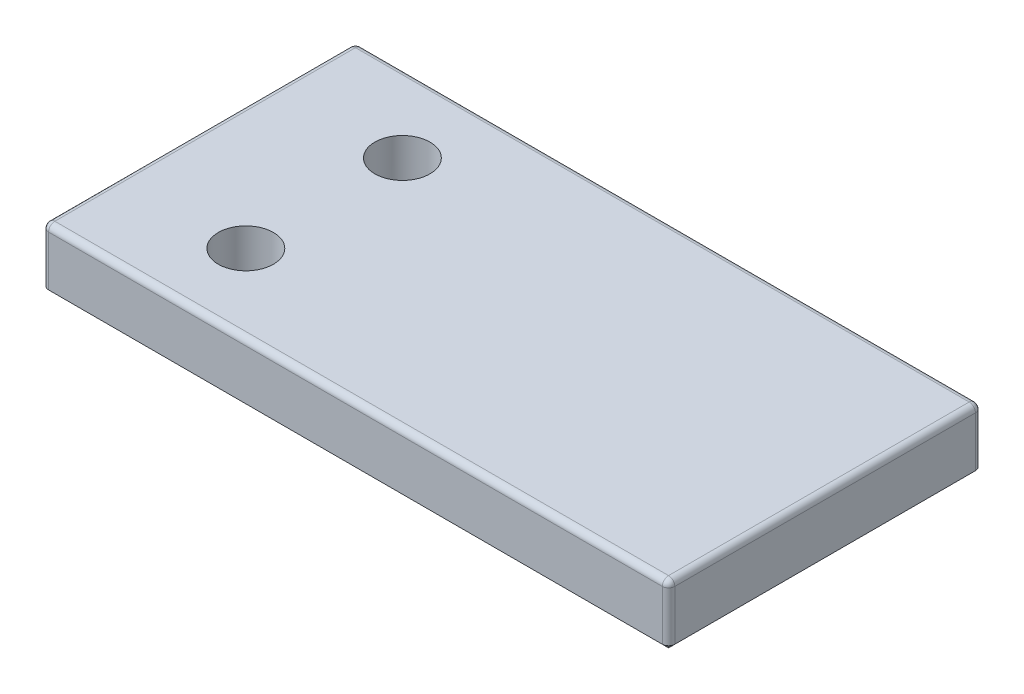
ISO-10303-21;
HEADER;
FILE_DESCRIPTION(('STEP AP214'),'2;1');
FILE_NAME('part.step','',(''),(''),'','','');
FILE_SCHEMA(('AUTOMOTIVE_DESIGN { 1 0 10303 214 1 1 1 1 }'));
ENDSEC;
DATA;
#1=APPLICATION_CONTEXT('core data for automotive mechanical design processes');
#2=APPLICATION_PROTOCOL_DEFINITION('international standard','automotive_design',2000,#1);
#3=PRODUCT_CONTEXT('',#1,'mechanical');
#4=PRODUCT('Part','Part','',(#3));
#5=PRODUCT_RELATED_PRODUCT_CATEGORY('part','',(#4));
#6=PRODUCT_DEFINITION_FORMATION('','',#4);
#7=PRODUCT_DEFINITION_CONTEXT('part definition',#1,'design');
#8=PRODUCT_DEFINITION('design','',#6,#7);
#9=PRODUCT_DEFINITION_SHAPE('','',#8);
#10=(LENGTH_UNIT() NAMED_UNIT(*) SI_UNIT(.MILLI.,.METRE.));
#11=(NAMED_UNIT(*) PLANE_ANGLE_UNIT() SI_UNIT($,.RADIAN.));
#12=(NAMED_UNIT(*) SI_UNIT($,.STERADIAN.) SOLID_ANGLE_UNIT());
#13=UNCERTAINTY_MEASURE_WITH_UNIT(LENGTH_MEASURE(1.E-05),#10,'distance_accuracy_value','');
#14=(GEOMETRIC_REPRESENTATION_CONTEXT(3) GLOBAL_UNCERTAINTY_ASSIGNED_CONTEXT((#13)) GLOBAL_UNIT_ASSIGNED_CONTEXT((#10,
#11,#12)) REPRESENTATION_CONTEXT('',''));
#15=CARTESIAN_POINT('',(0.,0.,0.));
#16=DIRECTION('',(0.,0.,1.));
#17=DIRECTION('',(1.,0.,0.));
#18=AXIS2_PLACEMENT_3D('',#15,#16,#17);
#19=CARTESIAN_POINT('',(0.,10.,0.));
#20=DIRECTION('',(1.,0.,0.));
#21=DIRECTION('',(0.,0.,-1.));
#22=AXIS2_PLACEMENT_3D('',#19,#20,#21);
#23=PLANE('',#22);
#24=DIRECTION('',(0.,-1.,0.));
#25=VECTOR('',#24,1.);
#26=CARTESIAN_POINT('',(0.,10.,-1.));
#27=LINE('',#26,#25);
#28=CARTESIAN_POINT('',(0.,1.,-1.));
#29=VERTEX_POINT('',#28);
#30=CARTESIAN_POINT('',(0.,9.,-1.));
#31=VERTEX_POINT('',#30);
#32=EDGE_CURVE('E263',#29,#31,#27,.F.);
#33=ORIENTED_EDGE('',*,*,#32,.T.);
#34=DIRECTION('',(0.,0.,1.));
#35=VECTOR('',#34,1.);
#36=CARTESIAN_POINT('',(0.,9.,0.));
#37=LINE('',#36,#35);
#38=CARTESIAN_POINT('',(0.,9.,-49.));
#39=VERTEX_POINT('',#38);
#40=EDGE_CURVE('E225',#31,#39,#37,.F.);
#41=ORIENTED_EDGE('',*,*,#40,.T.);
#42=DIRECTION('',(0.,-1.,0.));
#43=VECTOR('',#42,1.);
#44=CARTESIAN_POINT('',(0.,10.,-49.));
#45=LINE('',#44,#43);
#46=CARTESIAN_POINT('',(0.,1.,-49.));
#47=VERTEX_POINT('',#46);
#48=EDGE_CURVE('E266',#39,#47,#45,.T.);
#49=ORIENTED_EDGE('',*,*,#48,.T.);
#50=DIRECTION('',(0.,0.,1.));
#51=VECTOR('',#50,1.);
#52=CARTESIAN_POINT('',(0.,1.,-1.));
#53=LINE('',#52,#51);
#54=EDGE_CURVE('E153',#47,#29,#53,.T.);
#55=ORIENTED_EDGE('',*,*,#54,.T.);
#56=EDGE_LOOP('',(#33,#41,#49,#55));
#57=FACE_BOUND('',#56,.T.);
#58=ADVANCED_FACE('F39',(#57),#23,.F.);
#59=CARTESIAN_POINT('',(0.,10.,0.));
#60=DIRECTION('',(0.,0.,-1.));
#61=DIRECTION('',(-1.,0.,0.));
#62=AXIS2_PLACEMENT_3D('',#59,#60,#61);
#63=PLANE('',#62);
#64=DIRECTION('',(0.,-1.,0.));
#65=VECTOR('',#64,1.);
#66=CARTESIAN_POINT('',(99.,10.,0.));
#67=LINE('',#66,#65);
#68=CARTESIAN_POINT('',(99.,1.,0.));
#69=VERTEX_POINT('',#68);
#70=CARTESIAN_POINT('',(99.,9.,0.));
#71=VERTEX_POINT('',#70);
#72=EDGE_CURVE('E173',#69,#71,#67,.F.);
#73=ORIENTED_EDGE('',*,*,#72,.T.);
#74=DIRECTION('',(1.,0.,0.));
#75=VECTOR('',#74,1.);
#76=CARTESIAN_POINT('',(0.,9.,0.));
#77=LINE('',#76,#75);
#78=CARTESIAN_POINT('',(1.,9.,0.));
#79=VERTEX_POINT('',#78);
#80=EDGE_CURVE('E11',#71,#79,#77,.F.);
#81=ORIENTED_EDGE('',*,*,#80,.T.);
#82=DIRECTION('',(0.,-1.,0.));
#83=VECTOR('',#82,1.);
#84=CARTESIAN_POINT('',(1.,10.,0.));
#85=LINE('',#84,#83);
#86=CARTESIAN_POINT('',(1.,1.,0.));
#87=VERTEX_POINT('',#86);
#88=EDGE_CURVE('E169',#79,#87,#85,.T.);
#89=ORIENTED_EDGE('',*,*,#88,.T.);
#90=DIRECTION('',(1.,0.,0.));
#91=VECTOR('',#90,1.);
#92=CARTESIAN_POINT('',(99.,1.,0.));
#93=LINE('',#92,#91);
#94=EDGE_CURVE('E194',#87,#69,#93,.T.);
#95=ORIENTED_EDGE('',*,*,#94,.T.);
#96=EDGE_LOOP('',(#73,#81,#89,#95));
#97=FACE_BOUND('',#96,.T.);
#98=ADVANCED_FACE('F272',(#97),#63,.F.);
#99=CARTESIAN_POINT('',(100.,10.,0.));
#100=DIRECTION('',(-1.,0.,0.));
#101=DIRECTION('',(0.,0.,1.));
#102=AXIS2_PLACEMENT_3D('',#99,#100,#101);
#103=PLANE('',#102);
#104=DIRECTION('',(0.,-1.,0.));
#105=VECTOR('',#104,1.);
#106=CARTESIAN_POINT('',(100.,10.,-49.));
#107=LINE('',#106,#105);
#108=CARTESIAN_POINT('',(100.,1.,-49.));
#109=VERTEX_POINT('',#108);
#110=CARTESIAN_POINT('',(100.,9.,-49.));
#111=VERTEX_POINT('',#110);
#112=EDGE_CURVE('E149',#109,#111,#107,.F.);
#113=ORIENTED_EDGE('',*,*,#112,.T.);
#114=DIRECTION('',(0.,0.,-1.));
#115=VECTOR('',#114,1.);
#116=CARTESIAN_POINT('',(100.,9.,0.));
#117=LINE('',#116,#115);
#118=CARTESIAN_POINT('',(100.,9.,-1.));
#119=VERTEX_POINT('',#118);
#120=EDGE_CURVE('E63',#111,#119,#117,.F.);
#121=ORIENTED_EDGE('',*,*,#120,.T.);
#122=DIRECTION('',(0.,-1.,0.));
#123=VECTOR('',#122,1.);
#124=CARTESIAN_POINT('',(100.,10.,-1.));
#125=LINE('',#124,#123);
#126=CARTESIAN_POINT('',(100.,1.,-1.));
#127=VERTEX_POINT('',#126);
#128=EDGE_CURVE('E141',#119,#127,#125,.T.);
#129=ORIENTED_EDGE('',*,*,#128,.T.);
#130=DIRECTION('',(0.,0.,-1.));
#131=VECTOR('',#130,1.);
#132=CARTESIAN_POINT('',(100.,1.,-49.));
#133=LINE('',#132,#131);
#134=EDGE_CURVE('E186',#127,#109,#133,.T.);
#135=ORIENTED_EDGE('',*,*,#134,.T.);
#136=EDGE_LOOP('',(#113,#121,#129,#135));
#137=FACE_BOUND('',#136,.T.);
#138=ADVANCED_FACE('F261',(#137),#103,.F.);
#139=CARTESIAN_POINT('',(0.,10.,-50.));
#140=DIRECTION('',(0.,0.,1.));
#141=DIRECTION('',(1.,0.,0.));
#142=AXIS2_PLACEMENT_3D('',#139,#140,#141);
#143=PLANE('',#142);
#144=DIRECTION('',(0.,-1.,0.));
#145=VECTOR('',#144,1.);
#146=CARTESIAN_POINT('',(1.,10.,-50.));
#147=LINE('',#146,#145);
#148=CARTESIAN_POINT('',(1.,1.,-50.));
#149=VERTEX_POINT('',#148);
#150=CARTESIAN_POINT('',(1.,9.,-50.));
#151=VERTEX_POINT('',#150);
#152=EDGE_CURVE('E142',#149,#151,#147,.F.);
#153=ORIENTED_EDGE('',*,*,#152,.T.);
#154=DIRECTION('',(-1.,0.,0.));
#155=VECTOR('',#154,1.);
#156=CARTESIAN_POINT('',(0.,9.,-50.));
#157=LINE('',#156,#155);
#158=CARTESIAN_POINT('',(99.,9.,-50.));
#159=VERTEX_POINT('',#158);
#160=EDGE_CURVE('E138',#151,#159,#157,.F.);
#161=ORIENTED_EDGE('',*,*,#160,.T.);
#162=DIRECTION('',(0.,-1.,0.));
#163=VECTOR('',#162,1.);
#164=CARTESIAN_POINT('',(99.,10.,-50.));
#165=LINE('',#164,#163);
#166=CARTESIAN_POINT('',(99.,1.,-50.));
#167=VERTEX_POINT('',#166);
#168=EDGE_CURVE('E130',#159,#167,#165,.T.);
#169=ORIENTED_EDGE('',*,*,#168,.T.);
#170=DIRECTION('',(-1.,0.,0.));
#171=VECTOR('',#170,1.);
#172=CARTESIAN_POINT('',(1.,1.,-50.));
#173=LINE('',#172,#171);
#174=EDGE_CURVE('E135',#167,#149,#173,.T.);
#175=ORIENTED_EDGE('',*,*,#174,.T.);
#176=EDGE_LOOP('',(#153,#161,#169,#175));
#177=FACE_BOUND('',#176,.T.);
#178=ADVANCED_FACE('F133',(#177),#143,.F.);
#179=CARTESIAN_POINT('',(0.,10.,0.));
#180=DIRECTION('',(0.,-1.,0.));
#181=DIRECTION('',(0.,0.,-1.));
#182=AXIS2_PLACEMENT_3D('',#179,#180,#181);
#183=PLANE('',#182);
#184=DIRECTION('',(-1.,0.,0.));
#185=VECTOR('',#184,1.);
#186=CARTESIAN_POINT('',(0.,10.,-49.));
#187=LINE('',#186,#185);
#188=CARTESIAN_POINT('',(99.,10.,-49.));
#189=VERTEX_POINT('',#188);
#190=CARTESIAN_POINT('',(1.,10.,-49.));
#191=VERTEX_POINT('',#190);
#192=EDGE_CURVE('E220',#189,#191,#187,.T.);
#193=ORIENTED_EDGE('',*,*,#192,.T.);
#194=DIRECTION('',(0.,0.,1.));
#195=VECTOR('',#194,1.);
#196=CARTESIAN_POINT('',(1.,10.,0.));
#197=LINE('',#196,#195);
#198=CARTESIAN_POINT('',(1.,10.,-1.));
#199=VERTEX_POINT('',#198);
#200=EDGE_CURVE('E222',#191,#199,#197,.T.);
#201=ORIENTED_EDGE('',*,*,#200,.T.);
#202=DIRECTION('',(1.,0.,0.));
#203=VECTOR('',#202,1.);
#204=CARTESIAN_POINT('',(0.,10.,-1.));
#205=LINE('',#204,#203);
#206=CARTESIAN_POINT('',(99.,10.,-1.));
#207=VERTEX_POINT('',#206);
#208=EDGE_CURVE('E216',#199,#207,#205,.T.);
#209=ORIENTED_EDGE('',*,*,#208,.T.);
#210=DIRECTION('',(0.,0.,-1.));
#211=VECTOR('',#210,1.);
#212=CARTESIAN_POINT('',(99.,10.,0.));
#213=LINE('',#212,#211);
#214=EDGE_CURVE('E218',#207,#189,#213,.T.);
#215=ORIENTED_EDGE('',*,*,#214,.T.);
#216=EDGE_LOOP('',(#193,#201,#209,#215));
#217=FACE_BOUND('',#216,.T.);
#218=CARTESIAN_POINT('',(20.,10.,-37.5));
#219=DIRECTION('',(0.,1.,0.));
#220=DIRECTION('',(0.,0.,1.));
#221=AXIS2_PLACEMENT_3D('',#218,#219,#220);
#222=CIRCLE('',#221,4.4);
#223=CARTESIAN_POINT('',(20.,10.,-33.1));
#224=VERTEX_POINT('',#223);
#225=EDGE_CURVE('E213',#224,#224,#222,.T.);
#226=ORIENTED_EDGE('',*,*,#225,.F.);
#227=EDGE_LOOP('',(#226));
#228=FACE_BOUND('',#227,.T.);
#229=CARTESIAN_POINT('',(20.,10.,-12.5));
#230=DIRECTION('',(0.,1.,0.));
#231=DIRECTION('',(0.,0.,1.));
#232=AXIS2_PLACEMENT_3D('',#229,#230,#231);
#233=CIRCLE('',#232,4.4);
#234=CARTESIAN_POINT('',(20.,10.,-8.1));
#235=VERTEX_POINT('',#234);
#236=EDGE_CURVE('E313',#235,#235,#233,.T.);
#237=ORIENTED_EDGE('',*,*,#236,.F.);
#238=EDGE_LOOP('',(#237));
#239=FACE_BOUND('',#238,.T.);
#240=ADVANCED_FACE('F326',(#217,#228,#239),#183,.F.);
#241=CARTESIAN_POINT('',(0.,0.,0.));
#242=DIRECTION('',(0.,-1.,0.));
#243=DIRECTION('',(0.,0.,-1.));
#244=AXIS2_PLACEMENT_3D('',#241,#242,#243);
#245=PLANE('',#244);
#246=DIRECTION('',(0.,0.,-1.));
#247=VECTOR('',#246,1.);
#248=CARTESIAN_POINT('',(1.,0.,-49.));
#249=LINE('',#248,#247);
#250=CARTESIAN_POINT('',(1.,0.,-1.));
#251=VERTEX_POINT('',#250);
#252=CARTESIAN_POINT('',(1.,0.,-49.));
#253=VERTEX_POINT('',#252);
#254=EDGE_CURVE('E178',#251,#253,#249,.T.);
#255=ORIENTED_EDGE('',*,*,#254,.T.);
#256=DIRECTION('',(1.,0.,0.));
#257=VECTOR('',#256,1.);
#258=CARTESIAN_POINT('',(99.,0.,-49.));
#259=LINE('',#258,#257);
#260=CARTESIAN_POINT('',(99.,0.,-49.));
#261=VERTEX_POINT('',#260);
#262=EDGE_CURVE('E180',#253,#261,#259,.T.);
#263=ORIENTED_EDGE('',*,*,#262,.T.);
#264=DIRECTION('',(0.,0.,1.));
#265=VECTOR('',#264,1.);
#266=CARTESIAN_POINT('',(99.,0.,-1.));
#267=LINE('',#266,#265);
#268=CARTESIAN_POINT('',(99.,0.,-1.));
#269=VERTEX_POINT('',#268);
#270=EDGE_CURVE('E171',#261,#269,#267,.T.);
#271=ORIENTED_EDGE('',*,*,#270,.T.);
#272=DIRECTION('',(-1.,0.,0.));
#273=VECTOR('',#272,1.);
#274=CARTESIAN_POINT('',(1.,0.,-1.));
#275=LINE('',#274,#273);
#276=EDGE_CURVE('E168',#269,#251,#275,.T.);
#277=ORIENTED_EDGE('',*,*,#276,.T.);
#278=EDGE_LOOP('',(#255,#263,#271,#277));
#279=FACE_BOUND('',#278,.T.);
#280=CARTESIAN_POINT('',(20.,0.,-37.5));
#281=DIRECTION('',(0.,-1.,0.));
#282=DIRECTION('',(0.,0.,-1.));
#283=AXIS2_PLACEMENT_3D('',#280,#281,#282);
#284=CIRCLE('',#283,4.4);
#285=CARTESIAN_POINT('',(20.,0.,-41.9));
#286=VERTEX_POINT('',#285);
#287=EDGE_CURVE('E316',#286,#286,#284,.T.);
#288=ORIENTED_EDGE('',*,*,#287,.F.);
#289=EDGE_LOOP('',(#288));
#290=FACE_BOUND('',#289,.T.);
#291=CARTESIAN_POINT('',(20.,0.,-12.5));
#292=DIRECTION('',(0.,-1.,0.));
#293=DIRECTION('',(0.,0.,-1.));
#294=AXIS2_PLACEMENT_3D('',#291,#292,#293);
#295=CIRCLE('',#294,4.4);
#296=CARTESIAN_POINT('',(20.,0.,-16.9));
#297=VERTEX_POINT('',#296);
#298=EDGE_CURVE('E310',#297,#297,#295,.T.);
#299=ORIENTED_EDGE('',*,*,#298,.F.);
#300=EDGE_LOOP('',(#299));
#301=FACE_BOUND('',#300,.T.);
#302=ADVANCED_FACE('F329',(#279,#290,#301),#245,.T.);
#303=CARTESIAN_POINT('',(20.,10.,-12.5));
#304=DIRECTION('',(0.,1.,0.));
#305=DIRECTION('',(0.,0.,1.));
#306=AXIS2_PLACEMENT_3D('',#303,#304,#305);
#307=CYLINDRICAL_SURFACE('',#306,4.4);
#308=ORIENTED_EDGE('',*,*,#298,.T.);
#309=EDGE_LOOP('',(#308));
#310=FACE_BOUND('',#309,.T.);
#311=ORIENTED_EDGE('',*,*,#236,.T.);
#312=EDGE_LOOP('',(#311));
#313=FACE_BOUND('',#312,.T.);
#314=ADVANCED_FACE('F334',(#310,#313),#307,.F.);
#315=CARTESIAN_POINT('',(20.,10.,-37.5));
#316=DIRECTION('',(0.,1.,0.));
#317=DIRECTION('',(0.,0.,1.));
#318=AXIS2_PLACEMENT_3D('',#315,#316,#317);
#319=CYLINDRICAL_SURFACE('',#318,4.4);
#320=ORIENTED_EDGE('',*,*,#287,.T.);
#321=EDGE_LOOP('',(#320));
#322=FACE_BOUND('',#321,.T.);
#323=ORIENTED_EDGE('',*,*,#225,.T.);
#324=EDGE_LOOP('',(#323));
#325=FACE_BOUND('',#324,.T.);
#326=ADVANCED_FACE('F324',(#322,#325),#319,.F.);
#327=CARTESIAN_POINT('',(99.,10.,-49.));
#328=DIRECTION('',(0.,-1.,0.));
#329=DIRECTION('',(0.,0.,-1.));
#330=AXIS2_PLACEMENT_3D('',#327,#328,#329);
#331=CYLINDRICAL_SURFACE('',#330,1.);
#332=ORIENTED_EDGE('',*,*,#168,.F.);
#333=CARTESIAN_POINT('',(99.,9.,-49.));
#334=DIRECTION('',(0.,-1.,0.));
#335=DIRECTION('',(0.,0.,-1.));
#336=AXIS2_PLACEMENT_3D('',#333,#334,#335);
#337=CIRCLE('',#336,1.);
#338=EDGE_CURVE('E230',#159,#111,#337,.T.);
#339=ORIENTED_EDGE('',*,*,#338,.T.);
#340=ORIENTED_EDGE('',*,*,#112,.F.);
#341=CARTESIAN_POINT('',(99.,1.,-49.));
#342=DIRECTION('',(0.,-1.,0.));
#343=DIRECTION('',(0.,0.,-1.));
#344=AXIS2_PLACEMENT_3D('',#341,#342,#343);
#345=CIRCLE('',#344,1.);
#346=EDGE_CURVE('E146',#109,#167,#345,.F.);
#347=ORIENTED_EDGE('',*,*,#346,.T.);
#348=EDGE_LOOP('',(#332,#339,#340,#347));
#349=FACE_BOUND('',#348,.T.);
#350=ADVANCED_FACE('F148',(#349),#331,.T.);
#351=CARTESIAN_POINT('',(1.,10.,-49.));
#352=DIRECTION('',(0.,-1.,0.));
#353=DIRECTION('',(0.,0.,-1.));
#354=AXIS2_PLACEMENT_3D('',#351,#352,#353);
#355=CYLINDRICAL_SURFACE('',#354,1.);
#356=ORIENTED_EDGE('',*,*,#48,.F.);
#357=CARTESIAN_POINT('',(1.,9.,-49.));
#358=DIRECTION('',(0.,-1.,0.));
#359=DIRECTION('',(0.,0.,-1.));
#360=AXIS2_PLACEMENT_3D('',#357,#358,#359);
#361=CIRCLE('',#360,1.);
#362=EDGE_CURVE('E227',#39,#151,#361,.T.);
#363=ORIENTED_EDGE('',*,*,#362,.T.);
#364=ORIENTED_EDGE('',*,*,#152,.F.);
#365=CARTESIAN_POINT('',(1.,1.,-49.));
#366=DIRECTION('',(0.,-1.,0.));
#367=DIRECTION('',(0.,0.,-1.));
#368=AXIS2_PLACEMENT_3D('',#365,#366,#367);
#369=CIRCLE('',#368,1.);
#370=EDGE_CURVE('E154',#149,#47,#369,.F.);
#371=ORIENTED_EDGE('',*,*,#370,.T.);
#372=EDGE_LOOP('',(#356,#363,#364,#371));
#373=FACE_BOUND('',#372,.T.);
#374=ADVANCED_FACE('F308',(#373),#355,.T.);
#375=CARTESIAN_POINT('',(1.,10.,-1.));
#376=DIRECTION('',(0.,-1.,0.));
#377=DIRECTION('',(0.,0.,-1.));
#378=AXIS2_PLACEMENT_3D('',#375,#376,#377);
#379=CYLINDRICAL_SURFACE('',#378,1.);
#380=ORIENTED_EDGE('',*,*,#88,.F.);
#381=CARTESIAN_POINT('',(1.,9.,-1.));
#382=DIRECTION('',(0.,-1.,0.));
#383=DIRECTION('',(0.,0.,-1.));
#384=AXIS2_PLACEMENT_3D('',#381,#382,#383);
#385=CIRCLE('',#384,1.);
#386=EDGE_CURVE('E196',#79,#31,#385,.T.);
#387=ORIENTED_EDGE('',*,*,#386,.T.);
#388=ORIENTED_EDGE('',*,*,#32,.F.);
#389=CARTESIAN_POINT('',(1.,1.,-1.));
#390=DIRECTION('',(0.,-1.,0.));
#391=DIRECTION('',(0.,0.,-1.));
#392=AXIS2_PLACEMENT_3D('',#389,#390,#391);
#393=CIRCLE('',#392,1.);
#394=EDGE_CURVE('E188',#29,#87,#393,.F.);
#395=ORIENTED_EDGE('',*,*,#394,.T.);
#396=EDGE_LOOP('',(#380,#387,#388,#395));
#397=FACE_BOUND('',#396,.T.);
#398=ADVANCED_FACE('F297',(#397),#379,.T.);
#399=CARTESIAN_POINT('',(99.,10.,-1.));
#400=DIRECTION('',(0.,-1.,0.));
#401=DIRECTION('',(0.,0.,-1.));
#402=AXIS2_PLACEMENT_3D('',#399,#400,#401);
#403=CYLINDRICAL_SURFACE('',#402,1.);
#404=ORIENTED_EDGE('',*,*,#128,.F.);
#405=CARTESIAN_POINT('',(99.,9.,-1.));
#406=DIRECTION('',(0.,-1.,0.));
#407=DIRECTION('',(0.,0.,-1.));
#408=AXIS2_PLACEMENT_3D('',#405,#406,#407);
#409=CIRCLE('',#408,1.);
#410=EDGE_CURVE('E48',#119,#71,#409,.T.);
#411=ORIENTED_EDGE('',*,*,#410,.T.);
#412=ORIENTED_EDGE('',*,*,#72,.F.);
#413=CARTESIAN_POINT('',(99.,1.,-1.));
#414=DIRECTION('',(0.,-1.,0.));
#415=DIRECTION('',(0.,0.,-1.));
#416=AXIS2_PLACEMENT_3D('',#413,#414,#415);
#417=CIRCLE('',#416,1.);
#418=EDGE_CURVE('E191',#69,#127,#417,.F.);
#419=ORIENTED_EDGE('',*,*,#418,.T.);
#420=EDGE_LOOP('',(#404,#411,#412,#419));
#421=FACE_BOUND('',#420,.T.);
#422=ADVANCED_FACE('F360',(#421),#403,.T.);
#423=CARTESIAN_POINT('',(0.,1.,0.));
#424=DIRECTION('',(0.,-0.707106781186547,0.707106781186547));
#425=DIRECTION('',(-1.,0.,0.));
#426=AXIS2_PLACEMENT_3D('',#423,#424,#425);
#427=PLANE('',#426);
#428=DIRECTION('',(0.,-0.707106781186547,-0.707106781186547));
#429=VECTOR('',#428,1.);
#430=CARTESIAN_POINT('',(99.,1.,0.));
#431=LINE('',#430,#429);
#432=EDGE_CURVE('E210',#69,#269,#431,.T.);
#433=ORIENTED_EDGE('',*,*,#432,.F.);
#434=ORIENTED_EDGE('',*,*,#94,.F.);
#435=DIRECTION('',(0.,0.707106781186547,0.707106781186547));
#436=VECTOR('',#435,1.);
#437=CARTESIAN_POINT('',(1.,0.,-1.));
#438=LINE('',#437,#436);
#439=EDGE_CURVE('E207',#251,#87,#438,.T.);
#440=ORIENTED_EDGE('',*,*,#439,.F.);
#441=ORIENTED_EDGE('',*,*,#276,.F.);
#442=EDGE_LOOP('',(#433,#434,#440,#441));
#443=FACE_BOUND('',#442,.T.);
#444=ADVANCED_FACE('F363',(#443),#427,.T.);
#445=CARTESIAN_POINT('',(99.,1.,-1.));
#446=DIRECTION('',(0.,1.,0.));
#447=DIRECTION('',(0.,0.,1.));
#448=AXIS2_PLACEMENT_3D('',#445,#446,#447);
#449=CONICAL_SURFACE('',#448,1.,0.785398163397448);
#450=ORIENTED_EDGE('',*,*,#418,.F.);
#451=ORIENTED_EDGE('',*,*,#432,.T.);
#452=DIRECTION('',(-0.707106781186547,-0.707106781186547,0.));
#453=VECTOR('',#452,1.);
#454=CARTESIAN_POINT('',(100.,1.,-1.));
#455=LINE('',#454,#453);
#456=EDGE_CURVE('E204',#127,#269,#455,.T.);
#457=ORIENTED_EDGE('',*,*,#456,.F.);
#458=EDGE_LOOP('',(#450,#451,#457));
#459=FACE_BOUND('',#458,.T.);
#460=ADVANCED_FACE('F379',(#459),#449,.T.);
#461=CARTESIAN_POINT('',(1.,1.,-1.));
#462=DIRECTION('',(0.,1.,0.));
#463=DIRECTION('',(0.,0.,1.));
#464=AXIS2_PLACEMENT_3D('',#461,#462,#463);
#465=CONICAL_SURFACE('',#464,1.,0.785398163397448);
#466=ORIENTED_EDGE('',*,*,#439,.T.);
#467=ORIENTED_EDGE('',*,*,#394,.F.);
#468=DIRECTION('',(-0.707106781186547,0.707106781186547,0.));
#469=VECTOR('',#468,1.);
#470=CARTESIAN_POINT('',(1.,0.,-1.));
#471=LINE('',#470,#469);
#472=EDGE_CURVE('E201',#251,#29,#471,.T.);
#473=ORIENTED_EDGE('',*,*,#472,.F.);
#474=EDGE_LOOP('',(#466,#467,#473));
#475=FACE_BOUND('',#474,.T.);
#476=ADVANCED_FACE('F375',(#475),#465,.T.);
#477=CARTESIAN_POINT('',(100.,1.,0.));
#478=DIRECTION('',(0.707106781186547,-0.707106781186547,0.));
#479=DIRECTION('',(0.,0.,1.));
#480=AXIS2_PLACEMENT_3D('',#477,#478,#479);
#481=PLANE('',#480);
#482=ORIENTED_EDGE('',*,*,#456,.T.);
#483=ORIENTED_EDGE('',*,*,#270,.F.);
#484=DIRECTION('',(-0.707106781186547,-0.707106781186547,0.));
#485=VECTOR('',#484,1.);
#486=CARTESIAN_POINT('',(100.,1.,-49.));
#487=LINE('',#486,#485);
#488=EDGE_CURVE('E158',#109,#261,#487,.T.);
#489=ORIENTED_EDGE('',*,*,#488,.F.);
#490=ORIENTED_EDGE('',*,*,#134,.F.);
#491=EDGE_LOOP('',(#482,#483,#489,#490));
#492=FACE_BOUND('',#491,.T.);
#493=ADVANCED_FACE('F372',(#492),#481,.T.);
#494=CARTESIAN_POINT('',(0.,1.,0.));
#495=DIRECTION('',(-0.707106781186547,-0.707106781186547,0.));
#496=DIRECTION('',(0.,0.,-1.));
#497=AXIS2_PLACEMENT_3D('',#494,#495,#496);
#498=PLANE('',#497);
#499=ORIENTED_EDGE('',*,*,#472,.T.);
#500=ORIENTED_EDGE('',*,*,#54,.F.);
#501=DIRECTION('',(-0.707106781186547,0.707106781186547,0.));
#502=VECTOR('',#501,1.);
#503=CARTESIAN_POINT('',(1.,0.,-49.));
#504=LINE('',#503,#502);
#505=EDGE_CURVE('E162',#253,#47,#504,.T.);
#506=ORIENTED_EDGE('',*,*,#505,.F.);
#507=ORIENTED_EDGE('',*,*,#254,.F.);
#508=EDGE_LOOP('',(#499,#500,#506,#507));
#509=FACE_BOUND('',#508,.T.);
#510=ADVANCED_FACE('F302',(#509),#498,.T.);
#511=CARTESIAN_POINT('',(99.,1.,-49.));
#512=DIRECTION('',(0.,1.,0.));
#513=DIRECTION('',(0.,0.,1.));
#514=AXIS2_PLACEMENT_3D('',#511,#512,#513);
#515=CONICAL_SURFACE('',#514,1.,0.785398163397448);
#516=ORIENTED_EDGE('',*,*,#346,.F.);
#517=ORIENTED_EDGE('',*,*,#488,.T.);
#518=DIRECTION('',(0.,-0.707106781186547,0.707106781186547));
#519=VECTOR('',#518,1.);
#520=CARTESIAN_POINT('',(99.,1.,-50.));
#521=LINE('',#520,#519);
#522=EDGE_CURVE('E156',#167,#261,#521,.T.);
#523=ORIENTED_EDGE('',*,*,#522,.F.);
#524=EDGE_LOOP('',(#516,#517,#523));
#525=FACE_BOUND('',#524,.T.);
#526=ADVANCED_FACE('F157',(#525),#515,.T.);
#527=CARTESIAN_POINT('',(1.,1.,-49.));
#528=DIRECTION('',(0.,1.,0.));
#529=DIRECTION('',(0.,0.,1.));
#530=AXIS2_PLACEMENT_3D('',#527,#528,#529);
#531=CONICAL_SURFACE('',#530,1.,0.785398163397448);
#532=ORIENTED_EDGE('',*,*,#505,.T.);
#533=ORIENTED_EDGE('',*,*,#370,.F.);
#534=DIRECTION('',(0.,0.707106781186547,-0.707106781186547));
#535=VECTOR('',#534,1.);
#536=CARTESIAN_POINT('',(1.,0.,-49.));
#537=LINE('',#536,#535);
#538=EDGE_CURVE('E163',#253,#149,#537,.T.);
#539=ORIENTED_EDGE('',*,*,#538,.F.);
#540=EDGE_LOOP('',(#532,#533,#539));
#541=FACE_BOUND('',#540,.T.);
#542=ADVANCED_FACE('F306',(#541),#531,.T.);
#543=CARTESIAN_POINT('',(0.,1.,-50.));
#544=DIRECTION('',(0.,-0.707106781186547,-0.707106781186547));
#545=DIRECTION('',(1.,0.,0.));
#546=AXIS2_PLACEMENT_3D('',#543,#544,#545);
#547=PLANE('',#546);
#548=ORIENTED_EDGE('',*,*,#522,.T.);
#549=ORIENTED_EDGE('',*,*,#262,.F.);
#550=ORIENTED_EDGE('',*,*,#538,.T.);
#551=ORIENTED_EDGE('',*,*,#174,.F.);
#552=EDGE_LOOP('',(#548,#549,#550,#551));
#553=FACE_BOUND('',#552,.T.);
#554=ADVANCED_FACE('F165',(#553),#547,.T.);
#555=CARTESIAN_POINT('',(99.,9.,-49.));
#556=DIRECTION('',(0.,-1.,0.));
#557=DIRECTION('',(0.,0.,-1.));
#558=AXIS2_PLACEMENT_3D('',#555,#556,#557);
#559=SPHERICAL_SURFACE('',#558,1.);
#560=CARTESIAN_POINT('',(99.,9.,-49.));
#561=DIRECTION('',(0.,0.,1.));
#562=DIRECTION('',(1.,0.,0.));
#563=AXIS2_PLACEMENT_3D('',#560,#561,#562);
#564=CIRCLE('',#563,1.);
#565=EDGE_CURVE('E249',#111,#189,#564,.T.);
#566=ORIENTED_EDGE('',*,*,#565,.F.);
#567=ORIENTED_EDGE('',*,*,#338,.F.);
#568=CARTESIAN_POINT('',(99.,9.,-49.));
#569=DIRECTION('',(-1.,0.,0.));
#570=DIRECTION('',(0.,0.,1.));
#571=AXIS2_PLACEMENT_3D('',#568,#569,#570);
#572=CIRCLE('',#571,1.);
#573=EDGE_CURVE('E43',#189,#159,#572,.T.);
#574=ORIENTED_EDGE('',*,*,#573,.F.);
#575=EDGE_LOOP('',(#566,#567,#574));
#576=FACE_BOUND('',#575,.T.);
#577=ADVANCED_FACE('F41',(#576),#559,.T.);
#578=CARTESIAN_POINT('',(0.,9.,-49.));
#579=DIRECTION('',(-1.,0.,0.));
#580=DIRECTION('',(0.,0.,1.));
#581=AXIS2_PLACEMENT_3D('',#578,#579,#580);
#582=CYLINDRICAL_SURFACE('',#581,1.);
#583=ORIENTED_EDGE('',*,*,#573,.T.);
#584=ORIENTED_EDGE('',*,*,#160,.F.);
#585=CARTESIAN_POINT('',(1.,9.,-49.));
#586=DIRECTION('',(-1.,0.,0.));
#587=DIRECTION('',(0.,0.,1.));
#588=AXIS2_PLACEMENT_3D('',#585,#586,#587);
#589=CIRCLE('',#588,1.);
#590=EDGE_CURVE('E247',#191,#151,#589,.T.);
#591=ORIENTED_EDGE('',*,*,#590,.F.);
#592=ORIENTED_EDGE('',*,*,#192,.F.);
#593=EDGE_LOOP('',(#583,#584,#591,#592));
#594=FACE_BOUND('',#593,.T.);
#595=ADVANCED_FACE('F258',(#594),#582,.T.);
#596=CARTESIAN_POINT('',(99.,9.,0.));
#597=DIRECTION('',(0.,0.,-1.));
#598=DIRECTION('',(-1.,0.,0.));
#599=AXIS2_PLACEMENT_3D('',#596,#597,#598);
#600=CYLINDRICAL_SURFACE('',#599,1.);
#601=ORIENTED_EDGE('',*,*,#565,.T.);
#602=ORIENTED_EDGE('',*,*,#214,.F.);
#603=CARTESIAN_POINT('',(99.,9.,-1.));
#604=DIRECTION('',(0.,0.,1.));
#605=DIRECTION('',(1.,0.,0.));
#606=AXIS2_PLACEMENT_3D('',#603,#604,#605);
#607=CIRCLE('',#606,1.);
#608=EDGE_CURVE('E244',#119,#207,#607,.T.);
#609=ORIENTED_EDGE('',*,*,#608,.F.);
#610=ORIENTED_EDGE('',*,*,#120,.F.);
#611=EDGE_LOOP('',(#601,#602,#609,#610));
#612=FACE_BOUND('',#611,.T.);
#613=ADVANCED_FACE('F398',(#612),#600,.T.);
#614=CARTESIAN_POINT('',(1.,9.,-49.));
#615=DIRECTION('',(0.,-1.,0.));
#616=DIRECTION('',(0.,0.,-1.));
#617=AXIS2_PLACEMENT_3D('',#614,#615,#616);
#618=SPHERICAL_SURFACE('',#617,1.);
#619=ORIENTED_EDGE('',*,*,#590,.T.);
#620=ORIENTED_EDGE('',*,*,#362,.F.);
#621=CARTESIAN_POINT('',(1.,9.,-49.));
#622=DIRECTION('',(0.,0.,1.));
#623=DIRECTION('',(1.,0.,0.));
#624=AXIS2_PLACEMENT_3D('',#621,#622,#623);
#625=CIRCLE('',#624,1.);
#626=EDGE_CURVE('E241',#191,#39,#625,.T.);
#627=ORIENTED_EDGE('',*,*,#626,.F.);
#628=EDGE_LOOP('',(#619,#620,#627));
#629=FACE_BOUND('',#628,.T.);
#630=ADVANCED_FACE('F395',(#629),#618,.T.);
#631=CARTESIAN_POINT('',(99.,9.,-1.));
#632=DIRECTION('',(0.,-1.,0.));
#633=DIRECTION('',(0.,0.,-1.));
#634=AXIS2_PLACEMENT_3D('',#631,#632,#633);
#635=SPHERICAL_SURFACE('',#634,1.);
#636=ORIENTED_EDGE('',*,*,#410,.F.);
#637=ORIENTED_EDGE('',*,*,#608,.T.);
#638=CARTESIAN_POINT('',(99.,9.,-1.));
#639=DIRECTION('',(-1.,0.,0.));
#640=DIRECTION('',(0.,0.,1.));
#641=AXIS2_PLACEMENT_3D('',#638,#639,#640);
#642=CIRCLE('',#641,1.);
#643=EDGE_CURVE('E238',#71,#207,#642,.T.);
#644=ORIENTED_EDGE('',*,*,#643,.F.);
#645=EDGE_LOOP('',(#636,#637,#644));
#646=FACE_BOUND('',#645,.T.);
#647=ADVANCED_FACE('F278',(#646),#635,.T.);
#648=CARTESIAN_POINT('',(1.,9.,0.));
#649=DIRECTION('',(0.,0.,1.));
#650=DIRECTION('',(1.,0.,0.));
#651=AXIS2_PLACEMENT_3D('',#648,#649,#650);
#652=CYLINDRICAL_SURFACE('',#651,1.);
#653=ORIENTED_EDGE('',*,*,#626,.T.);
#654=ORIENTED_EDGE('',*,*,#40,.F.);
#655=CARTESIAN_POINT('',(1.,9.,-1.));
#656=DIRECTION('',(0.,0.,1.));
#657=DIRECTION('',(1.,0.,0.));
#658=AXIS2_PLACEMENT_3D('',#655,#656,#657);
#659=CIRCLE('',#658,1.);
#660=EDGE_CURVE('E236',#199,#31,#659,.T.);
#661=ORIENTED_EDGE('',*,*,#660,.F.);
#662=ORIENTED_EDGE('',*,*,#200,.F.);
#663=EDGE_LOOP('',(#653,#654,#661,#662));
#664=FACE_BOUND('',#663,.T.);
#665=ADVANCED_FACE('F291',(#664),#652,.T.);
#666=CARTESIAN_POINT('',(0.,9.,-1.));
#667=DIRECTION('',(1.,0.,0.));
#668=DIRECTION('',(0.,0.,-1.));
#669=AXIS2_PLACEMENT_3D('',#666,#667,#668);
#670=CYLINDRICAL_SURFACE('',#669,1.);
#671=ORIENTED_EDGE('',*,*,#643,.T.);
#672=ORIENTED_EDGE('',*,*,#208,.F.);
#673=CARTESIAN_POINT('',(1.,9.,-1.));
#674=DIRECTION('',(-1.,0.,0.));
#675=DIRECTION('',(0.,0.,1.));
#676=AXIS2_PLACEMENT_3D('',#673,#674,#675);
#677=CIRCLE('',#676,1.);
#678=EDGE_CURVE('E234',#79,#199,#677,.T.);
#679=ORIENTED_EDGE('',*,*,#678,.F.);
#680=ORIENTED_EDGE('',*,*,#80,.F.);
#681=EDGE_LOOP('',(#671,#672,#679,#680));
#682=FACE_BOUND('',#681,.T.);
#683=ADVANCED_FACE('F283',(#682),#670,.T.);
#684=CARTESIAN_POINT('',(1.,9.,-1.));
#685=DIRECTION('',(0.,-1.,0.));
#686=DIRECTION('',(0.,0.,-1.));
#687=AXIS2_PLACEMENT_3D('',#684,#685,#686);
#688=SPHERICAL_SURFACE('',#687,1.);
#689=ORIENTED_EDGE('',*,*,#660,.T.);
#690=ORIENTED_EDGE('',*,*,#386,.F.);
#691=ORIENTED_EDGE('',*,*,#678,.T.);
#692=EDGE_LOOP('',(#689,#690,#691));
#693=FACE_BOUND('',#692,.T.);
#694=ADVANCED_FACE('F287',(#693),#688,.T.);
#695=CLOSED_SHELL('',(#58,#98,#138,#178,#240,#302,#314,#326,#350,#374,#398,#422,#444,#460,#476,
#493,#510,#526,#542,#554,#577,#595,#613,#630,#647,#665,#683,#694));
#696=MANIFOLD_SOLID_BREP('B2',#695);
#697=ADVANCED_BREP_SHAPE_REPRESENTATION('',(#18,#696),#14);
#698=SHAPE_DEFINITION_REPRESENTATION(#9,#697);
ENDSEC;
END-ISO-10303-21;
